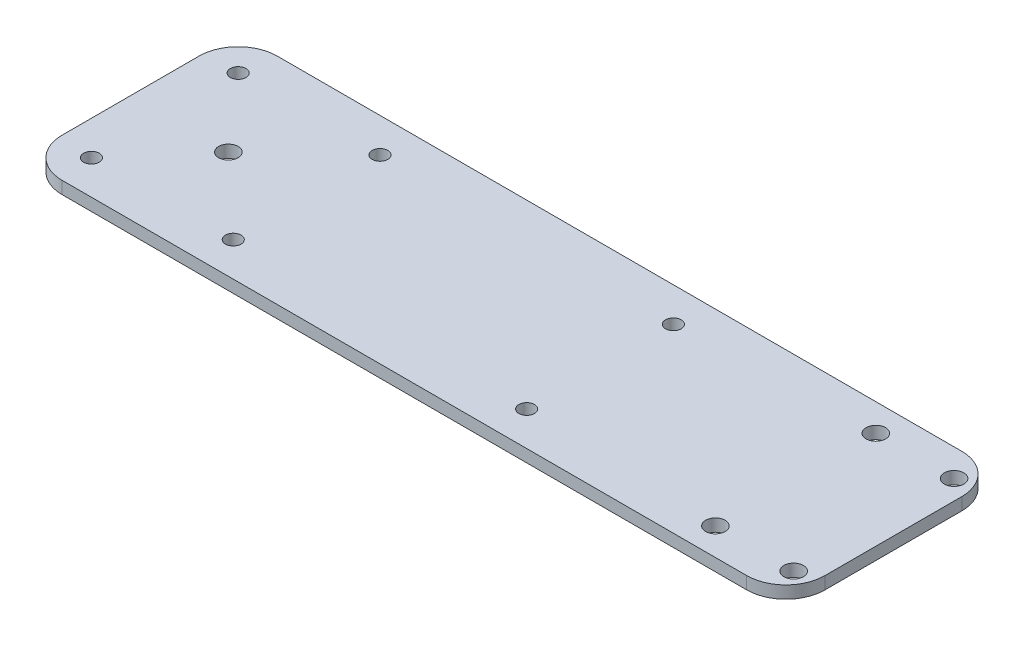
ISO-10303-21;
HEADER;
FILE_DESCRIPTION(('STEP AP214'),'2;1');
FILE_NAME('part.step','',(''),(''),'','','');
FILE_SCHEMA(('AUTOMOTIVE_DESIGN { 1 0 10303 214 1 1 1 1 }'));
ENDSEC;
DATA;
#1=APPLICATION_CONTEXT('core data for automotive mechanical design processes');
#2=APPLICATION_PROTOCOL_DEFINITION('international standard','automotive_design',2000,#1);
#3=PRODUCT_CONTEXT('',#1,'mechanical');
#4=PRODUCT('Part','Part','',(#3));
#5=PRODUCT_RELATED_PRODUCT_CATEGORY('part','',(#4));
#6=PRODUCT_DEFINITION_FORMATION('','',#4);
#7=PRODUCT_DEFINITION_CONTEXT('part definition',#1,'design');
#8=PRODUCT_DEFINITION('design','',#6,#7);
#9=PRODUCT_DEFINITION_SHAPE('','',#8);
#10=(LENGTH_UNIT() NAMED_UNIT(*) SI_UNIT(.MILLI.,.METRE.));
#11=(NAMED_UNIT(*) PLANE_ANGLE_UNIT() SI_UNIT($,.RADIAN.));
#12=(NAMED_UNIT(*) SI_UNIT($,.STERADIAN.) SOLID_ANGLE_UNIT());
#13=UNCERTAINTY_MEASURE_WITH_UNIT(LENGTH_MEASURE(1.E-05),#10,'distance_accuracy_value','');
#14=(GEOMETRIC_REPRESENTATION_CONTEXT(3) GLOBAL_UNCERTAINTY_ASSIGNED_CONTEXT((#13)) GLOBAL_UNIT_ASSIGNED_CONTEXT((#10,
#11,#12)) REPRESENTATION_CONTEXT('',''));
#15=CARTESIAN_POINT('',(0.,0.,0.));
#16=DIRECTION('',(0.,0.,1.));
#17=DIRECTION('',(1.,0.,0.));
#18=AXIS2_PLACEMENT_3D('',#15,#16,#17);
#19=CARTESIAN_POINT('',(-25.,3.175,-27.5));
#20=DIRECTION('',(1.,0.,0.));
#21=DIRECTION('',(0.,0.,-1.));
#22=AXIS2_PLACEMENT_3D('',#19,#20,#21);
#23=PLANE('',#22);
#24=DIRECTION('',(0.,0.,1.));
#25=VECTOR('',#24,1.);
#26=CARTESIAN_POINT('',(-25.,0.,-27.5));
#27=LINE('',#26,#25);
#28=CARTESIAN_POINT('',(-25.,0.,-17.5));
#29=VERTEX_POINT('',#28);
#30=CARTESIAN_POINT('',(-25.,0.,17.5));
#31=VERTEX_POINT('',#30);
#32=EDGE_CURVE('E129',#29,#31,#27,.T.);
#33=ORIENTED_EDGE('',*,*,#32,.T.);
#34=DIRECTION('',(0.,-1.,0.));
#35=VECTOR('',#34,1.);
#36=CARTESIAN_POINT('',(-25.,3.175,17.5));
#37=LINE('',#36,#35);
#38=CARTESIAN_POINT('',(-25.,3.175,17.5));
#39=VERTEX_POINT('',#38);
#40=EDGE_CURVE('E107',#31,#39,#37,.F.);
#41=ORIENTED_EDGE('',*,*,#40,.T.);
#42=DIRECTION('',(0.,0.,1.));
#43=VECTOR('',#42,1.);
#44=CARTESIAN_POINT('',(-25.,3.175,-27.5));
#45=LINE('',#44,#43);
#46=CARTESIAN_POINT('',(-25.,3.175,-17.5));
#47=VERTEX_POINT('',#46);
#48=EDGE_CURVE('E139',#47,#39,#45,.T.);
#49=ORIENTED_EDGE('',*,*,#48,.F.);
#50=DIRECTION('',(0.,-1.,0.));
#51=VECTOR('',#50,1.);
#52=CARTESIAN_POINT('',(-25.,3.175,-17.5));
#53=LINE('',#52,#51);
#54=EDGE_CURVE('E112',#47,#29,#53,.T.);
#55=ORIENTED_EDGE('',*,*,#54,.T.);
#56=EDGE_LOOP('',(#33,#41,#49,#55));
#57=FACE_BOUND('',#56,.T.);
#58=ADVANCED_FACE('F36',(#57),#23,.F.);
#59=CARTESIAN_POINT('',(-25.,3.175,27.5));
#60=DIRECTION('',(0.,0.,-1.));
#61=DIRECTION('',(-1.,0.,0.));
#62=AXIS2_PLACEMENT_3D('',#59,#60,#61);
#63=PLANE('',#62);
#64=DIRECTION('',(1.,0.,0.));
#65=VECTOR('',#64,1.);
#66=CARTESIAN_POINT('',(-25.,3.175,27.5));
#67=LINE('',#66,#65);
#68=CARTESIAN_POINT('',(-15.,3.175,27.5));
#69=VERTEX_POINT('',#68);
#70=CARTESIAN_POINT('',(160.,3.175,27.5));
#71=VERTEX_POINT('',#70);
#72=EDGE_CURVE('E122',#69,#71,#67,.T.);
#73=ORIENTED_EDGE('',*,*,#72,.F.);
#74=DIRECTION('',(0.,-1.,0.));
#75=VECTOR('',#74,1.);
#76=CARTESIAN_POINT('',(-15.,3.175,27.5));
#77=LINE('',#76,#75);
#78=CARTESIAN_POINT('',(-15.,0.,27.5));
#79=VERTEX_POINT('',#78);
#80=EDGE_CURVE('E106',#69,#79,#77,.T.);
#81=ORIENTED_EDGE('',*,*,#80,.T.);
#82=DIRECTION('',(1.,0.,0.));
#83=VECTOR('',#82,1.);
#84=CARTESIAN_POINT('',(-25.,0.,27.5));
#85=LINE('',#84,#83);
#86=CARTESIAN_POINT('',(160.,0.,27.5));
#87=VERTEX_POINT('',#86);
#88=EDGE_CURVE('E119',#79,#87,#85,.T.);
#89=ORIENTED_EDGE('',*,*,#88,.T.);
#90=DIRECTION('',(0.,-1.,0.));
#91=VECTOR('',#90,1.);
#92=CARTESIAN_POINT('',(160.,3.175,27.5));
#93=LINE('',#92,#91);
#94=EDGE_CURVE('E124',#87,#71,#93,.F.);
#95=ORIENTED_EDGE('',*,*,#94,.T.);
#96=EDGE_LOOP('',(#73,#81,#89,#95));
#97=FACE_BOUND('',#96,.T.);
#98=ADVANCED_FACE('F118',(#97),#63,.F.);
#99=CARTESIAN_POINT('',(170.,3.175,-27.5));
#100=DIRECTION('',(-1.,0.,0.));
#101=DIRECTION('',(0.,0.,1.));
#102=AXIS2_PLACEMENT_3D('',#99,#100,#101);
#103=PLANE('',#102);
#104=DIRECTION('',(0.,0.,-1.));
#105=VECTOR('',#104,1.);
#106=CARTESIAN_POINT('',(170.,0.,-27.5));
#107=LINE('',#106,#105);
#108=CARTESIAN_POINT('',(170.,0.,17.5));
#109=VERTEX_POINT('',#108);
#110=CARTESIAN_POINT('',(170.,0.,-17.5));
#111=VERTEX_POINT('',#110);
#112=EDGE_CURVE('E128',#109,#111,#107,.T.);
#113=ORIENTED_EDGE('',*,*,#112,.T.);
#114=DIRECTION('',(0.,-1.,0.));
#115=VECTOR('',#114,1.);
#116=CARTESIAN_POINT('',(170.,3.175,-17.5));
#117=LINE('',#116,#115);
#118=CARTESIAN_POINT('',(170.,3.175,-17.5));
#119=VERTEX_POINT('',#118);
#120=EDGE_CURVE('E11',#111,#119,#117,.F.);
#121=ORIENTED_EDGE('',*,*,#120,.T.);
#122=DIRECTION('',(0.,0.,-1.));
#123=VECTOR('',#122,1.);
#124=CARTESIAN_POINT('',(170.,3.175,-27.5));
#125=LINE('',#124,#123);
#126=CARTESIAN_POINT('',(170.,3.175,17.5));
#127=VERTEX_POINT('',#126);
#128=EDGE_CURVE('E165',#127,#119,#125,.T.);
#129=ORIENTED_EDGE('',*,*,#128,.F.);
#130=DIRECTION('',(0.,-1.,0.));
#131=VECTOR('',#130,1.);
#132=CARTESIAN_POINT('',(170.,3.175,17.5));
#133=LINE('',#132,#131);
#134=EDGE_CURVE('E44',#127,#109,#133,.T.);
#135=ORIENTED_EDGE('',*,*,#134,.T.);
#136=EDGE_LOOP('',(#113,#121,#129,#135));
#137=FACE_BOUND('',#136,.T.);
#138=ADVANCED_FACE('F163',(#137),#103,.F.);
#139=CARTESIAN_POINT('',(-25.,3.175,-27.5));
#140=DIRECTION('',(0.,0.,1.));
#141=DIRECTION('',(1.,0.,0.));
#142=AXIS2_PLACEMENT_3D('',#139,#140,#141);
#143=PLANE('',#142);
#144=DIRECTION('',(-1.,0.,0.));
#145=VECTOR('',#144,1.);
#146=CARTESIAN_POINT('',(-25.,0.,-27.5));
#147=LINE('',#146,#145);
#148=CARTESIAN_POINT('',(160.,0.,-27.5));
#149=VERTEX_POINT('',#148);
#150=CARTESIAN_POINT('',(-15.,0.,-27.5));
#151=VERTEX_POINT('',#150);
#152=EDGE_CURVE('E132',#149,#151,#147,.T.);
#153=ORIENTED_EDGE('',*,*,#152,.T.);
#154=DIRECTION('',(0.,-1.,0.));
#155=VECTOR('',#154,1.);
#156=CARTESIAN_POINT('',(-15.,3.175,-27.5));
#157=LINE('',#156,#155);
#158=CARTESIAN_POINT('',(-15.,3.175,-27.5));
#159=VERTEX_POINT('',#158);
#160=EDGE_CURVE('E51',#151,#159,#157,.F.);
#161=ORIENTED_EDGE('',*,*,#160,.T.);
#162=DIRECTION('',(-1.,0.,0.));
#163=VECTOR('',#162,1.);
#164=CARTESIAN_POINT('',(-25.,3.175,-27.5));
#165=LINE('',#164,#163);
#166=CARTESIAN_POINT('',(160.,3.175,-27.5));
#167=VERTEX_POINT('',#166);
#168=EDGE_CURVE('E140',#167,#159,#165,.T.);
#169=ORIENTED_EDGE('',*,*,#168,.F.);
#170=DIRECTION('',(0.,-1.,0.));
#171=VECTOR('',#170,1.);
#172=CARTESIAN_POINT('',(160.,3.175,-27.5));
#173=LINE('',#172,#171);
#174=EDGE_CURVE('E156',#167,#149,#173,.T.);
#175=ORIENTED_EDGE('',*,*,#174,.T.);
#176=EDGE_LOOP('',(#153,#161,#169,#175));
#177=FACE_BOUND('',#176,.T.);
#178=ADVANCED_FACE('F172',(#177),#143,.F.);
#179=CARTESIAN_POINT('',(0.,3.175,0.));
#180=DIRECTION('',(0.,1.,0.));
#181=DIRECTION('',(0.,0.,1.));
#182=AXIS2_PLACEMENT_3D('',#179,#180,#181);
#183=PLANE('',#182);
#184=CARTESIAN_POINT('',(165.,3.175,-20.5));
#185=DIRECTION('',(0.,1.,0.));
#186=DIRECTION('',(0.,0.,1.));
#187=AXIS2_PLACEMENT_3D('',#184,#185,#186);
#188=CIRCLE('',#187,2.5);
#189=CARTESIAN_POINT('',(165.,3.175,-18.));
#190=VERTEX_POINT('',#189);
#191=EDGE_CURVE('E241',#190,#190,#188,.T.);
#192=ORIENTED_EDGE('',*,*,#191,.F.);
#193=EDGE_LOOP('',(#192));
#194=FACE_BOUND('',#193,.T.);
#195=CARTESIAN_POINT('',(145.,3.175,-20.5));
#196=DIRECTION('',(0.,1.,0.));
#197=DIRECTION('',(0.,0.,1.));
#198=AXIS2_PLACEMENT_3D('',#195,#196,#197);
#199=CIRCLE('',#198,2.5);
#200=CARTESIAN_POINT('',(145.,3.175,-18.));
#201=VERTEX_POINT('',#200);
#202=EDGE_CURVE('E235',#201,#201,#199,.T.);
#203=ORIENTED_EDGE('',*,*,#202,.F.);
#204=EDGE_LOOP('',(#203));
#205=FACE_BOUND('',#204,.T.);
#206=CARTESIAN_POINT('',(165.,3.175,20.5));
#207=DIRECTION('',(0.,1.,0.));
#208=DIRECTION('',(0.,0.,1.));
#209=AXIS2_PLACEMENT_3D('',#206,#207,#208);
#210=CIRCLE('',#209,2.5);
#211=CARTESIAN_POINT('',(165.,3.175,23.));
#212=VERTEX_POINT('',#211);
#213=EDGE_CURVE('E229',#212,#212,#210,.T.);
#214=ORIENTED_EDGE('',*,*,#213,.F.);
#215=EDGE_LOOP('',(#214));
#216=FACE_BOUND('',#215,.T.);
#217=CARTESIAN_POINT('',(145.,3.175,20.5));
#218=DIRECTION('',(0.,1.,0.));
#219=DIRECTION('',(0.,0.,1.));
#220=AXIS2_PLACEMENT_3D('',#217,#218,#219);
#221=CIRCLE('',#220,2.5);
#222=CARTESIAN_POINT('',(145.,3.175,23.));
#223=VERTEX_POINT('',#222);
#224=EDGE_CURVE('E223',#223,#223,#221,.T.);
#225=ORIENTED_EDGE('',*,*,#224,.F.);
#226=EDGE_LOOP('',(#225));
#227=FACE_BOUND('',#226,.T.);
#228=CARTESIAN_POINT('',(-16.25,3.175,18.75));
#229=DIRECTION('',(0.,1.,0.));
#230=DIRECTION('',(0.,0.,1.));
#231=AXIS2_PLACEMENT_3D('',#228,#229,#230);
#232=CIRCLE('',#231,2.);
#233=CARTESIAN_POINT('',(-16.25,3.175,20.75));
#234=VERTEX_POINT('',#233);
#235=EDGE_CURVE('E217',#234,#234,#232,.T.);
#236=ORIENTED_EDGE('',*,*,#235,.F.);
#237=EDGE_LOOP('',(#236));
#238=FACE_BOUND('',#237,.T.);
#239=CARTESIAN_POINT('',(20.,3.175,18.75));
#240=DIRECTION('',(0.,1.,0.));
#241=DIRECTION('',(0.,0.,1.));
#242=AXIS2_PLACEMENT_3D('',#239,#240,#241);
#243=CIRCLE('',#242,2.);
#244=CARTESIAN_POINT('',(20.,3.175,20.75));
#245=VERTEX_POINT('',#244);
#246=EDGE_CURVE('E211',#245,#245,#243,.T.);
#247=ORIENTED_EDGE('',*,*,#246,.F.);
#248=EDGE_LOOP('',(#247));
#249=FACE_BOUND('',#248,.T.);
#250=CARTESIAN_POINT('',(95.,3.175,18.75));
#251=DIRECTION('',(0.,1.,0.));
#252=DIRECTION('',(0.,0.,1.));
#253=AXIS2_PLACEMENT_3D('',#250,#251,#252);
#254=CIRCLE('',#253,2.);
#255=CARTESIAN_POINT('',(95.,3.175,20.75));
#256=VERTEX_POINT('',#255);
#257=EDGE_CURVE('E205',#256,#256,#254,.T.);
#258=ORIENTED_EDGE('',*,*,#257,.F.);
#259=EDGE_LOOP('',(#258));
#260=FACE_BOUND('',#259,.T.);
#261=CARTESIAN_POINT('',(95.,3.175,-18.75));
#262=DIRECTION('',(0.,1.,0.));
#263=DIRECTION('',(0.,0.,1.));
#264=AXIS2_PLACEMENT_3D('',#261,#262,#263);
#265=CIRCLE('',#264,2.);
#266=CARTESIAN_POINT('',(95.,3.175,-16.75));
#267=VERTEX_POINT('',#266);
#268=EDGE_CURVE('E199',#267,#267,#265,.T.);
#269=ORIENTED_EDGE('',*,*,#268,.F.);
#270=EDGE_LOOP('',(#269));
#271=FACE_BOUND('',#270,.T.);
#272=CARTESIAN_POINT('',(20.,3.175,-18.75));
#273=DIRECTION('',(0.,1.,0.));
#274=DIRECTION('',(0.,0.,1.));
#275=AXIS2_PLACEMENT_3D('',#272,#273,#274);
#276=CIRCLE('',#275,2.);
#277=CARTESIAN_POINT('',(20.,3.175,-16.75));
#278=VERTEX_POINT('',#277);
#279=EDGE_CURVE('E193',#278,#278,#276,.T.);
#280=ORIENTED_EDGE('',*,*,#279,.F.);
#281=EDGE_LOOP('',(#280));
#282=FACE_BOUND('',#281,.T.);
#283=CARTESIAN_POINT('',(-16.25,3.175,-18.75));
#284=DIRECTION('',(0.,1.,0.));
#285=DIRECTION('',(0.,0.,1.));
#286=AXIS2_PLACEMENT_3D('',#283,#284,#285);
#287=CIRCLE('',#286,2.);
#288=CARTESIAN_POINT('',(-16.25,3.175,-16.75));
#289=VERTEX_POINT('',#288);
#290=EDGE_CURVE('E187',#289,#289,#287,.T.);
#291=ORIENTED_EDGE('',*,*,#290,.F.);
#292=EDGE_LOOP('',(#291));
#293=FACE_BOUND('',#292,.T.);
#294=CARTESIAN_POINT('',(0.,3.175,0.));
#295=DIRECTION('',(0.,1.,0.));
#296=DIRECTION('',(0.,0.,1.));
#297=AXIS2_PLACEMENT_3D('',#294,#295,#296);
#298=CIRCLE('',#297,2.5);
#299=CARTESIAN_POINT('',(0.,3.175,2.5));
#300=VERTEX_POINT('',#299);
#301=EDGE_CURVE('E181',#300,#300,#298,.T.);
#302=ORIENTED_EDGE('',*,*,#301,.F.);
#303=EDGE_LOOP('',(#302));
#304=FACE_BOUND('',#303,.T.);
#305=ORIENTED_EDGE('',*,*,#48,.T.);
#306=CARTESIAN_POINT('',(-15.,3.175,17.5));
#307=DIRECTION('',(0.,1.,0.));
#308=DIRECTION('',(0.,0.,1.));
#309=AXIS2_PLACEMENT_3D('',#306,#307,#308);
#310=CIRCLE('',#309,10.);
#311=EDGE_CURVE('E154',#39,#69,#310,.T.);
#312=ORIENTED_EDGE('',*,*,#311,.T.);
#313=ORIENTED_EDGE('',*,*,#72,.T.);
#314=CARTESIAN_POINT('',(160.,3.175,17.5));
#315=DIRECTION('',(0.,1.,0.));
#316=DIRECTION('',(0.,0.,1.));
#317=AXIS2_PLACEMENT_3D('',#314,#315,#316);
#318=CIRCLE('',#317,10.);
#319=EDGE_CURVE('E149',#71,#127,#318,.T.);
#320=ORIENTED_EDGE('',*,*,#319,.T.);
#321=ORIENTED_EDGE('',*,*,#128,.T.);
#322=CARTESIAN_POINT('',(160.,3.175,-17.5));
#323=DIRECTION('',(0.,1.,0.));
#324=DIRECTION('',(0.,0.,1.));
#325=AXIS2_PLACEMENT_3D('',#322,#323,#324);
#326=CIRCLE('',#325,10.);
#327=EDGE_CURVE('E58',#119,#167,#326,.T.);
#328=ORIENTED_EDGE('',*,*,#327,.T.);
#329=ORIENTED_EDGE('',*,*,#168,.T.);
#330=CARTESIAN_POINT('',(-15.,3.175,-17.5));
#331=DIRECTION('',(0.,1.,0.));
#332=DIRECTION('',(0.,0.,1.));
#333=AXIS2_PLACEMENT_3D('',#330,#331,#332);
#334=CIRCLE('',#333,10.);
#335=EDGE_CURVE('E152',#159,#47,#334,.T.);
#336=ORIENTED_EDGE('',*,*,#335,.T.);
#337=EDGE_LOOP('',(#305,#312,#313,#320,#321,#328,#329,#336));
#338=FACE_BOUND('',#337,.T.);
#339=ADVANCED_FACE('F247',(#194,#205,#216,#227,#238,#249,#260,#271,#282,#293,#304,#338),#183,.T.);
#340=CARTESIAN_POINT('',(0.,0.,0.));
#341=DIRECTION('',(0.,1.,0.));
#342=DIRECTION('',(0.,0.,1.));
#343=AXIS2_PLACEMENT_3D('',#340,#341,#342);
#344=PLANE('',#343);
#345=CARTESIAN_POINT('',(165.,0.,-20.5));
#346=DIRECTION('',(0.,1.,0.));
#347=DIRECTION('',(0.,0.,1.));
#348=AXIS2_PLACEMENT_3D('',#345,#346,#347);
#349=CIRCLE('',#348,2.5);
#350=CARTESIAN_POINT('',(165.,0.,-18.));
#351=VERTEX_POINT('',#350);
#352=EDGE_CURVE('E238',#351,#351,#349,.T.);
#353=ORIENTED_EDGE('',*,*,#352,.T.);
#354=EDGE_LOOP('',(#353));
#355=FACE_BOUND('',#354,.T.);
#356=CARTESIAN_POINT('',(145.,0.,-20.5));
#357=DIRECTION('',(0.,1.,0.));
#358=DIRECTION('',(0.,0.,1.));
#359=AXIS2_PLACEMENT_3D('',#356,#357,#358);
#360=CIRCLE('',#359,2.5);
#361=CARTESIAN_POINT('',(145.,0.,-18.));
#362=VERTEX_POINT('',#361);
#363=EDGE_CURVE('E232',#362,#362,#360,.T.);
#364=ORIENTED_EDGE('',*,*,#363,.T.);
#365=EDGE_LOOP('',(#364));
#366=FACE_BOUND('',#365,.T.);
#367=CARTESIAN_POINT('',(165.,0.,20.5));
#368=DIRECTION('',(0.,1.,0.));
#369=DIRECTION('',(0.,0.,1.));
#370=AXIS2_PLACEMENT_3D('',#367,#368,#369);
#371=CIRCLE('',#370,2.5);
#372=CARTESIAN_POINT('',(165.,0.,23.));
#373=VERTEX_POINT('',#372);
#374=EDGE_CURVE('E226',#373,#373,#371,.T.);
#375=ORIENTED_EDGE('',*,*,#374,.T.);
#376=EDGE_LOOP('',(#375));
#377=FACE_BOUND('',#376,.T.);
#378=CARTESIAN_POINT('',(145.,0.,20.5));
#379=DIRECTION('',(0.,1.,0.));
#380=DIRECTION('',(0.,0.,1.));
#381=AXIS2_PLACEMENT_3D('',#378,#379,#380);
#382=CIRCLE('',#381,2.5);
#383=CARTESIAN_POINT('',(145.,0.,23.));
#384=VERTEX_POINT('',#383);
#385=EDGE_CURVE('E220',#384,#384,#382,.T.);
#386=ORIENTED_EDGE('',*,*,#385,.T.);
#387=EDGE_LOOP('',(#386));
#388=FACE_BOUND('',#387,.T.);
#389=CARTESIAN_POINT('',(-16.25,0.,18.75));
#390=DIRECTION('',(0.,1.,0.));
#391=DIRECTION('',(0.,0.,1.));
#392=AXIS2_PLACEMENT_3D('',#389,#390,#391);
#393=CIRCLE('',#392,2.);
#394=CARTESIAN_POINT('',(-16.25,0.,20.75));
#395=VERTEX_POINT('',#394);
#396=EDGE_CURVE('E214',#395,#395,#393,.T.);
#397=ORIENTED_EDGE('',*,*,#396,.T.);
#398=EDGE_LOOP('',(#397));
#399=FACE_BOUND('',#398,.T.);
#400=CARTESIAN_POINT('',(20.,0.,18.75));
#401=DIRECTION('',(0.,1.,0.));
#402=DIRECTION('',(0.,0.,1.));
#403=AXIS2_PLACEMENT_3D('',#400,#401,#402);
#404=CIRCLE('',#403,2.);
#405=CARTESIAN_POINT('',(20.,0.,20.75));
#406=VERTEX_POINT('',#405);
#407=EDGE_CURVE('E208',#406,#406,#404,.T.);
#408=ORIENTED_EDGE('',*,*,#407,.T.);
#409=EDGE_LOOP('',(#408));
#410=FACE_BOUND('',#409,.T.);
#411=CARTESIAN_POINT('',(95.,0.,18.75));
#412=DIRECTION('',(0.,1.,0.));
#413=DIRECTION('',(0.,0.,1.));
#414=AXIS2_PLACEMENT_3D('',#411,#412,#413);
#415=CIRCLE('',#414,2.);
#416=CARTESIAN_POINT('',(95.,0.,20.75));
#417=VERTEX_POINT('',#416);
#418=EDGE_CURVE('E202',#417,#417,#415,.T.);
#419=ORIENTED_EDGE('',*,*,#418,.T.);
#420=EDGE_LOOP('',(#419));
#421=FACE_BOUND('',#420,.T.);
#422=CARTESIAN_POINT('',(95.,0.,-18.75));
#423=DIRECTION('',(0.,1.,0.));
#424=DIRECTION('',(0.,0.,1.));
#425=AXIS2_PLACEMENT_3D('',#422,#423,#424);
#426=CIRCLE('',#425,2.);
#427=CARTESIAN_POINT('',(95.,0.,-16.75));
#428=VERTEX_POINT('',#427);
#429=EDGE_CURVE('E196',#428,#428,#426,.T.);
#430=ORIENTED_EDGE('',*,*,#429,.T.);
#431=EDGE_LOOP('',(#430));
#432=FACE_BOUND('',#431,.T.);
#433=CARTESIAN_POINT('',(20.,0.,-18.75));
#434=DIRECTION('',(0.,1.,0.));
#435=DIRECTION('',(0.,0.,1.));
#436=AXIS2_PLACEMENT_3D('',#433,#434,#435);
#437=CIRCLE('',#436,2.);
#438=CARTESIAN_POINT('',(20.,0.,-16.75));
#439=VERTEX_POINT('',#438);
#440=EDGE_CURVE('E190',#439,#439,#437,.T.);
#441=ORIENTED_EDGE('',*,*,#440,.T.);
#442=EDGE_LOOP('',(#441));
#443=FACE_BOUND('',#442,.T.);
#444=CARTESIAN_POINT('',(-16.25,0.,-18.75));
#445=DIRECTION('',(0.,1.,0.));
#446=DIRECTION('',(0.,0.,1.));
#447=AXIS2_PLACEMENT_3D('',#444,#445,#446);
#448=CIRCLE('',#447,2.);
#449=CARTESIAN_POINT('',(-16.25,0.,-16.75));
#450=VERTEX_POINT('',#449);
#451=EDGE_CURVE('E184',#450,#450,#448,.T.);
#452=ORIENTED_EDGE('',*,*,#451,.T.);
#453=EDGE_LOOP('',(#452));
#454=FACE_BOUND('',#453,.T.);
#455=CARTESIAN_POINT('',(0.,0.,0.));
#456=DIRECTION('',(0.,1.,0.));
#457=DIRECTION('',(0.,0.,1.));
#458=AXIS2_PLACEMENT_3D('',#455,#456,#457);
#459=CIRCLE('',#458,2.5);
#460=CARTESIAN_POINT('',(0.,0.,2.5));
#461=VERTEX_POINT('',#460);
#462=EDGE_CURVE('E134',#461,#461,#459,.T.);
#463=ORIENTED_EDGE('',*,*,#462,.T.);
#464=EDGE_LOOP('',(#463));
#465=FACE_BOUND('',#464,.T.);
#466=ORIENTED_EDGE('',*,*,#88,.F.);
#467=CARTESIAN_POINT('',(-15.,0.,17.5));
#468=DIRECTION('',(0.,1.,0.));
#469=DIRECTION('',(0.,0.,1.));
#470=AXIS2_PLACEMENT_3D('',#467,#468,#469);
#471=CIRCLE('',#470,10.);
#472=EDGE_CURVE('E102',#79,#31,#471,.F.);
#473=ORIENTED_EDGE('',*,*,#472,.T.);
#474=ORIENTED_EDGE('',*,*,#32,.F.);
#475=CARTESIAN_POINT('',(-15.,0.,-17.5));
#476=DIRECTION('',(0.,1.,0.));
#477=DIRECTION('',(0.,0.,1.));
#478=AXIS2_PLACEMENT_3D('',#475,#476,#477);
#479=CIRCLE('',#478,10.);
#480=EDGE_CURVE('E113',#29,#151,#479,.F.);
#481=ORIENTED_EDGE('',*,*,#480,.T.);
#482=ORIENTED_EDGE('',*,*,#152,.F.);
#483=CARTESIAN_POINT('',(160.,0.,-17.5));
#484=DIRECTION('',(0.,1.,0.));
#485=DIRECTION('',(0.,0.,1.));
#486=AXIS2_PLACEMENT_3D('',#483,#484,#485);
#487=CIRCLE('',#486,10.);
#488=EDGE_CURVE('E143',#149,#111,#487,.F.);
#489=ORIENTED_EDGE('',*,*,#488,.T.);
#490=ORIENTED_EDGE('',*,*,#112,.F.);
#491=CARTESIAN_POINT('',(160.,0.,17.5));
#492=DIRECTION('',(0.,1.,0.));
#493=DIRECTION('',(0.,0.,1.));
#494=AXIS2_PLACEMENT_3D('',#491,#492,#493);
#495=CIRCLE('',#494,10.);
#496=EDGE_CURVE('E123',#109,#87,#495,.F.);
#497=ORIENTED_EDGE('',*,*,#496,.T.);
#498=EDGE_LOOP('',(#466,#473,#474,#481,#482,#489,#490,#497));
#499=FACE_BOUND('',#498,.T.);
#500=ADVANCED_FACE('F126',(#355,#366,#377,#388,#399,#410,#421,#432,#443,#454,#465,#499),#344,.F.);
#501=CARTESIAN_POINT('',(-15.,3.175,17.5));
#502=DIRECTION('',(0.,-1.,0.));
#503=DIRECTION('',(0.,0.,-1.));
#504=AXIS2_PLACEMENT_3D('',#501,#502,#503);
#505=CYLINDRICAL_SURFACE('',#504,10.);
#506=ORIENTED_EDGE('',*,*,#311,.F.);
#507=ORIENTED_EDGE('',*,*,#40,.F.);
#508=ORIENTED_EDGE('',*,*,#472,.F.);
#509=ORIENTED_EDGE('',*,*,#80,.F.);
#510=EDGE_LOOP('',(#506,#507,#508,#509));
#511=FACE_BOUND('',#510,.T.);
#512=ADVANCED_FACE('F105',(#511),#505,.T.);
#513=CARTESIAN_POINT('',(-15.,3.175,-17.5));
#514=DIRECTION('',(0.,-1.,0.));
#515=DIRECTION('',(0.,0.,-1.));
#516=AXIS2_PLACEMENT_3D('',#513,#514,#515);
#517=CYLINDRICAL_SURFACE('',#516,10.);
#518=ORIENTED_EDGE('',*,*,#335,.F.);
#519=ORIENTED_EDGE('',*,*,#160,.F.);
#520=ORIENTED_EDGE('',*,*,#480,.F.);
#521=ORIENTED_EDGE('',*,*,#54,.F.);
#522=EDGE_LOOP('',(#518,#519,#520,#521));
#523=FACE_BOUND('',#522,.T.);
#524=ADVANCED_FACE('F274',(#523),#517,.T.);
#525=CARTESIAN_POINT('',(160.,3.175,-17.5));
#526=DIRECTION('',(0.,-1.,0.));
#527=DIRECTION('',(0.,0.,-1.));
#528=AXIS2_PLACEMENT_3D('',#525,#526,#527);
#529=CYLINDRICAL_SURFACE('',#528,10.);
#530=ORIENTED_EDGE('',*,*,#327,.F.);
#531=ORIENTED_EDGE('',*,*,#120,.F.);
#532=ORIENTED_EDGE('',*,*,#488,.F.);
#533=ORIENTED_EDGE('',*,*,#174,.F.);
#534=EDGE_LOOP('',(#530,#531,#532,#533));
#535=FACE_BOUND('',#534,.T.);
#536=ADVANCED_FACE('F171',(#535),#529,.T.);
#537=CARTESIAN_POINT('',(160.,3.175,17.5));
#538=DIRECTION('',(0.,-1.,0.));
#539=DIRECTION('',(0.,0.,-1.));
#540=AXIS2_PLACEMENT_3D('',#537,#538,#539);
#541=CYLINDRICAL_SURFACE('',#540,10.);
#542=ORIENTED_EDGE('',*,*,#319,.F.);
#543=ORIENTED_EDGE('',*,*,#94,.F.);
#544=ORIENTED_EDGE('',*,*,#496,.F.);
#545=ORIENTED_EDGE('',*,*,#134,.F.);
#546=EDGE_LOOP('',(#542,#543,#544,#545));
#547=FACE_BOUND('',#546,.T.);
#548=ADVANCED_FACE('F38',(#547),#541,.T.);
#549=CARTESIAN_POINT('',(0.,3.175,0.));
#550=DIRECTION('',(0.,1.,0.));
#551=DIRECTION('',(0.,0.,1.));
#552=AXIS2_PLACEMENT_3D('',#549,#550,#551);
#553=CYLINDRICAL_SURFACE('',#552,2.5);
#554=ORIENTED_EDGE('',*,*,#462,.F.);
#555=EDGE_LOOP('',(#554));
#556=FACE_BOUND('',#555,.T.);
#557=ORIENTED_EDGE('',*,*,#301,.T.);
#558=EDGE_LOOP('',(#557));
#559=FACE_BOUND('',#558,.T.);
#560=ADVANCED_FACE('F296',(#556,#559),#553,.F.);
#561=CARTESIAN_POINT('',(-16.25,3.175,-18.75));
#562=DIRECTION('',(0.,1.,0.));
#563=DIRECTION('',(0.,0.,1.));
#564=AXIS2_PLACEMENT_3D('',#561,#562,#563);
#565=CYLINDRICAL_SURFACE('',#564,2.);
#566=ORIENTED_EDGE('',*,*,#451,.F.);
#567=EDGE_LOOP('',(#566));
#568=FACE_BOUND('',#567,.T.);
#569=ORIENTED_EDGE('',*,*,#290,.T.);
#570=EDGE_LOOP('',(#569));
#571=FACE_BOUND('',#570,.T.);
#572=ADVANCED_FACE('F299',(#568,#571),#565,.F.);
#573=CARTESIAN_POINT('',(20.,3.175,-18.75));
#574=DIRECTION('',(0.,1.,0.));
#575=DIRECTION('',(0.,0.,1.));
#576=AXIS2_PLACEMENT_3D('',#573,#574,#575);
#577=CYLINDRICAL_SURFACE('',#576,2.);
#578=ORIENTED_EDGE('',*,*,#440,.F.);
#579=EDGE_LOOP('',(#578));
#580=FACE_BOUND('',#579,.T.);
#581=ORIENTED_EDGE('',*,*,#279,.T.);
#582=EDGE_LOOP('',(#581));
#583=FACE_BOUND('',#582,.T.);
#584=ADVANCED_FACE('F303',(#580,#583),#577,.F.);
#585=CARTESIAN_POINT('',(95.,3.175,-18.75));
#586=DIRECTION('',(0.,1.,0.));
#587=DIRECTION('',(0.,0.,1.));
#588=AXIS2_PLACEMENT_3D('',#585,#586,#587);
#589=CYLINDRICAL_SURFACE('',#588,2.);
#590=ORIENTED_EDGE('',*,*,#429,.F.);
#591=EDGE_LOOP('',(#590));
#592=FACE_BOUND('',#591,.T.);
#593=ORIENTED_EDGE('',*,*,#268,.T.);
#594=EDGE_LOOP('',(#593));
#595=FACE_BOUND('',#594,.T.);
#596=ADVANCED_FACE('F307',(#592,#595),#589,.F.);
#597=CARTESIAN_POINT('',(95.,3.175,18.75));
#598=DIRECTION('',(0.,1.,0.));
#599=DIRECTION('',(0.,0.,1.));
#600=AXIS2_PLACEMENT_3D('',#597,#598,#599);
#601=CYLINDRICAL_SURFACE('',#600,2.);
#602=ORIENTED_EDGE('',*,*,#418,.F.);
#603=EDGE_LOOP('',(#602));
#604=FACE_BOUND('',#603,.T.);
#605=ORIENTED_EDGE('',*,*,#257,.T.);
#606=EDGE_LOOP('',(#605));
#607=FACE_BOUND('',#606,.T.);
#608=ADVANCED_FACE('F311',(#604,#607),#601,.F.);
#609=CARTESIAN_POINT('',(20.,3.175,18.75));
#610=DIRECTION('',(0.,1.,0.));
#611=DIRECTION('',(0.,0.,1.));
#612=AXIS2_PLACEMENT_3D('',#609,#610,#611);
#613=CYLINDRICAL_SURFACE('',#612,2.);
#614=ORIENTED_EDGE('',*,*,#407,.F.);
#615=EDGE_LOOP('',(#614));
#616=FACE_BOUND('',#615,.T.);
#617=ORIENTED_EDGE('',*,*,#246,.T.);
#618=EDGE_LOOP('',(#617));
#619=FACE_BOUND('',#618,.T.);
#620=ADVANCED_FACE('F315',(#616,#619),#613,.F.);
#621=CARTESIAN_POINT('',(-16.25,3.175,18.75));
#622=DIRECTION('',(0.,1.,0.));
#623=DIRECTION('',(0.,0.,1.));
#624=AXIS2_PLACEMENT_3D('',#621,#622,#623);
#625=CYLINDRICAL_SURFACE('',#624,2.);
#626=ORIENTED_EDGE('',*,*,#396,.F.);
#627=EDGE_LOOP('',(#626));
#628=FACE_BOUND('',#627,.T.);
#629=ORIENTED_EDGE('',*,*,#235,.T.);
#630=EDGE_LOOP('',(#629));
#631=FACE_BOUND('',#630,.T.);
#632=ADVANCED_FACE('F319',(#628,#631),#625,.F.);
#633=CARTESIAN_POINT('',(145.,3.175,20.5));
#634=DIRECTION('',(0.,1.,0.));
#635=DIRECTION('',(0.,0.,1.));
#636=AXIS2_PLACEMENT_3D('',#633,#634,#635);
#637=CYLINDRICAL_SURFACE('',#636,2.5);
#638=ORIENTED_EDGE('',*,*,#385,.F.);
#639=EDGE_LOOP('',(#638));
#640=FACE_BOUND('',#639,.T.);
#641=ORIENTED_EDGE('',*,*,#224,.T.);
#642=EDGE_LOOP('',(#641));
#643=FACE_BOUND('',#642,.T.);
#644=ADVANCED_FACE('F323',(#640,#643),#637,.F.);
#645=CARTESIAN_POINT('',(165.,3.175,20.5));
#646=DIRECTION('',(0.,1.,0.));
#647=DIRECTION('',(0.,0.,1.));
#648=AXIS2_PLACEMENT_3D('',#645,#646,#647);
#649=CYLINDRICAL_SURFACE('',#648,2.5);
#650=ORIENTED_EDGE('',*,*,#374,.F.);
#651=EDGE_LOOP('',(#650));
#652=FACE_BOUND('',#651,.T.);
#653=ORIENTED_EDGE('',*,*,#213,.T.);
#654=EDGE_LOOP('',(#653));
#655=FACE_BOUND('',#654,.T.);
#656=ADVANCED_FACE('F327',(#652,#655),#649,.F.);
#657=CARTESIAN_POINT('',(145.,3.175,-20.5));
#658=DIRECTION('',(0.,1.,0.));
#659=DIRECTION('',(0.,0.,1.));
#660=AXIS2_PLACEMENT_3D('',#657,#658,#659);
#661=CYLINDRICAL_SURFACE('',#660,2.5);
#662=ORIENTED_EDGE('',*,*,#363,.F.);
#663=EDGE_LOOP('',(#662));
#664=FACE_BOUND('',#663,.T.);
#665=ORIENTED_EDGE('',*,*,#202,.T.);
#666=EDGE_LOOP('',(#665));
#667=FACE_BOUND('',#666,.T.);
#668=ADVANCED_FACE('F331',(#664,#667),#661,.F.);
#669=CARTESIAN_POINT('',(165.,3.175,-20.5));
#670=DIRECTION('',(0.,1.,0.));
#671=DIRECTION('',(0.,0.,1.));
#672=AXIS2_PLACEMENT_3D('',#669,#670,#671);
#673=CYLINDRICAL_SURFACE('',#672,2.5);
#674=ORIENTED_EDGE('',*,*,#352,.F.);
#675=EDGE_LOOP('',(#674));
#676=FACE_BOUND('',#675,.T.);
#677=ORIENTED_EDGE('',*,*,#191,.T.);
#678=EDGE_LOOP('',(#677));
#679=FACE_BOUND('',#678,.T.);
#680=ADVANCED_FACE('F245',(#676,#679),#673,.F.);
#681=CLOSED_SHELL('',(#58,#98,#138,#178,#339,#500,#512,#524,#536,#548,#560,#572,#584,#596,#608,
#620,#632,#644,#656,#668,#680));
#682=MANIFOLD_SOLID_BREP('B2',#681);
#683=ADVANCED_BREP_SHAPE_REPRESENTATION('',(#18,#682),#14);
#684=SHAPE_DEFINITION_REPRESENTATION(#9,#683);
ENDSEC;
END-ISO-10303-21;
